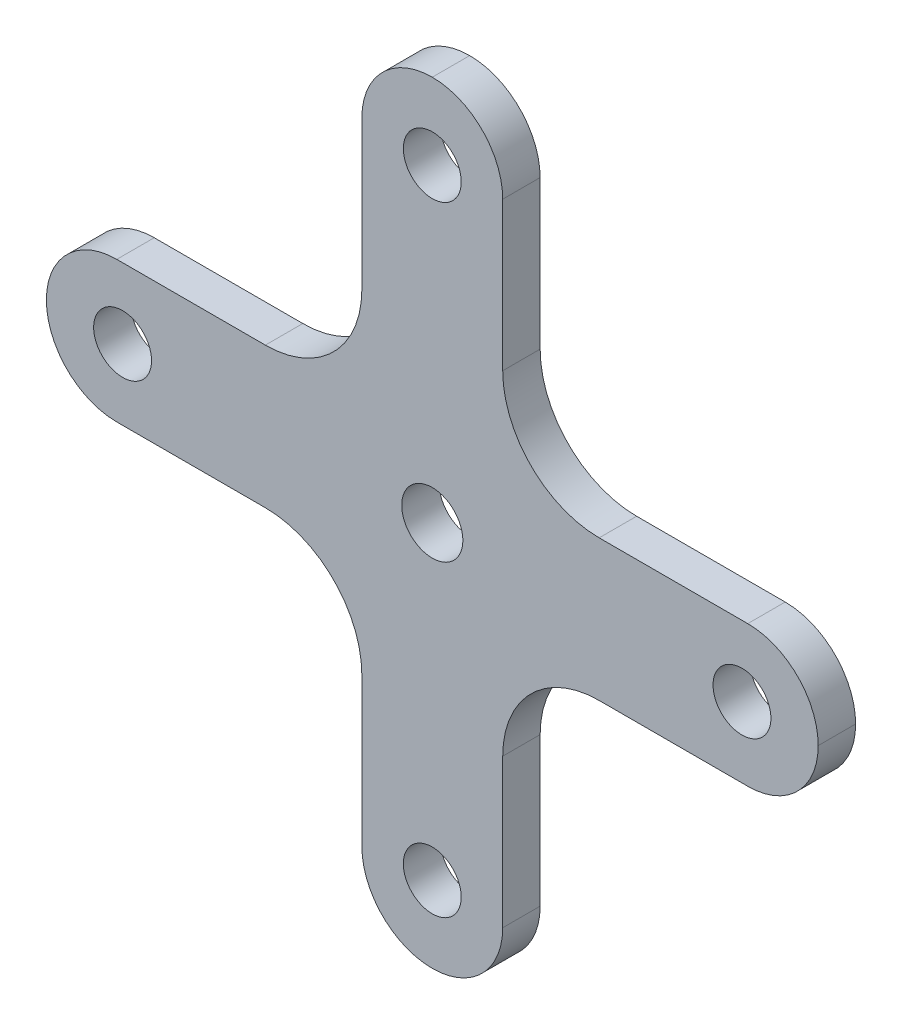
ISO-10303-21;
HEADER;
FILE_DESCRIPTION(('STEP AP214'),'2;1');
FILE_NAME('part.step','',(''),(''),'','','');
FILE_SCHEMA(('AUTOMOTIVE_DESIGN { 1 0 10303 214 1 1 1 1 }'));
ENDSEC;
DATA;
#1=APPLICATION_CONTEXT('core data for automotive mechanical design processes');
#2=APPLICATION_PROTOCOL_DEFINITION('international standard','automotive_design',2000,#1);
#3=PRODUCT_CONTEXT('',#1,'mechanical');
#4=PRODUCT('Part','Part','',(#3));
#5=PRODUCT_RELATED_PRODUCT_CATEGORY('part','',(#4));
#6=PRODUCT_DEFINITION_FORMATION('','',#4);
#7=PRODUCT_DEFINITION_CONTEXT('part definition',#1,'design');
#8=PRODUCT_DEFINITION('design','',#6,#7);
#9=PRODUCT_DEFINITION_SHAPE('','',#8);
#10=(LENGTH_UNIT() NAMED_UNIT(*) SI_UNIT(.MILLI.,.METRE.));
#11=(NAMED_UNIT(*) PLANE_ANGLE_UNIT() SI_UNIT($,.RADIAN.));
#12=(NAMED_UNIT(*) SI_UNIT($,.STERADIAN.) SOLID_ANGLE_UNIT());
#13=UNCERTAINTY_MEASURE_WITH_UNIT(LENGTH_MEASURE(1.E-05),#10,'distance_accuracy_value','');
#14=(GEOMETRIC_REPRESENTATION_CONTEXT(3) GLOBAL_UNCERTAINTY_ASSIGNED_CONTEXT((#13)) GLOBAL_UNIT_ASSIGNED_CONTEXT((#10,
#11,#12)) REPRESENTATION_CONTEXT('',''));
#15=CARTESIAN_POINT('',(0.,0.,0.));
#16=DIRECTION('',(0.,0.,1.));
#17=DIRECTION('',(1.,0.,0.));
#18=AXIS2_PLACEMENT_3D('',#15,#16,#17);
#19=CARTESIAN_POINT('',(-3.64999999999999,0.,0.97));
#20=DIRECTION('',(-1.,0.,0.));
#21=DIRECTION('',(0.,-1.,0.));
#22=AXIS2_PLACEMENT_3D('',#19,#20,#21);
#23=PLANE('',#22);
#24=DIRECTION('',(0.,1.,0.));
#25=VECTOR('',#24,1.);
#26=CARTESIAN_POINT('',(-3.64999999999999,0.,0.97));
#27=LINE('',#26,#25);
#28=CARTESIAN_POINT('',(-3.64999999999999,-16.35,0.97));
#29=VERTEX_POINT('',#28);
#30=CARTESIAN_POINT('',(-3.64999999999999,-8.65,0.97));
#31=VERTEX_POINT('',#30);
#32=EDGE_CURVE('E398',#29,#31,#27,.T.);
#33=ORIENTED_EDGE('',*,*,#32,.T.);
#34=DIRECTION('',(0.,0.,-1.));
#35=VECTOR('',#34,1.);
#36=CARTESIAN_POINT('',(-3.64999999999999,-8.65,0.97));
#37=LINE('',#36,#35);
#38=CARTESIAN_POINT('',(-3.64999999999999,-8.65,-0.97));
#39=VERTEX_POINT('',#38);
#40=EDGE_CURVE('E261',#31,#39,#37,.T.);
#41=ORIENTED_EDGE('',*,*,#40,.T.);
#42=DIRECTION('',(0.,1.,0.));
#43=VECTOR('',#42,1.);
#44=CARTESIAN_POINT('',(-3.64999999999999,0.,-0.97));
#45=LINE('',#44,#43);
#46=CARTESIAN_POINT('',(-3.64999999999999,-16.35,-0.97));
#47=VERTEX_POINT('',#46);
#48=EDGE_CURVE('E434',#47,#39,#45,.T.);
#49=ORIENTED_EDGE('',*,*,#48,.F.);
#50=DIRECTION('',(0.,0.,-1.));
#51=VECTOR('',#50,1.);
#52=CARTESIAN_POINT('',(-3.64999999999999,-16.35,0.97));
#53=LINE('',#52,#51);
#54=EDGE_CURVE('E249',#47,#29,#53,.F.);
#55=ORIENTED_EDGE('',*,*,#54,.T.);
#56=EDGE_LOOP('',(#33,#41,#49,#55));
#57=FACE_BOUND('',#56,.T.);
#58=ADVANCED_FACE('F37',(#57),#23,.T.);
#59=CARTESIAN_POINT('',(3.65000000000001,0.,0.97));
#60=DIRECTION('',(-1.,0.,0.));
#61=DIRECTION('',(0.,-1.,0.));
#62=AXIS2_PLACEMENT_3D('',#59,#60,#61);
#63=PLANE('',#62);
#64=DIRECTION('',(0.,1.,0.));
#65=VECTOR('',#64,1.);
#66=CARTESIAN_POINT('',(3.65000000000001,0.,-0.97));
#67=LINE('',#66,#65);
#68=CARTESIAN_POINT('',(3.65000000000001,-16.35,-0.97));
#69=VERTEX_POINT('',#68);
#70=CARTESIAN_POINT('',(3.65000000000001,-8.65,-0.97));
#71=VERTEX_POINT('',#70);
#72=EDGE_CURVE('E206',#69,#71,#67,.T.);
#73=ORIENTED_EDGE('',*,*,#72,.T.);
#74=DIRECTION('',(0.,0.,-1.));
#75=VECTOR('',#74,1.);
#76=CARTESIAN_POINT('',(3.65000000000001,-8.65,0.97));
#77=LINE('',#76,#75);
#78=CARTESIAN_POINT('',(3.65000000000001,-8.65,0.97));
#79=VERTEX_POINT('',#78);
#80=EDGE_CURVE('E281',#71,#79,#77,.F.);
#81=ORIENTED_EDGE('',*,*,#80,.T.);
#82=DIRECTION('',(0.,1.,0.));
#83=VECTOR('',#82,1.);
#84=CARTESIAN_POINT('',(3.65000000000001,0.,0.97));
#85=LINE('',#84,#83);
#86=CARTESIAN_POINT('',(3.65000000000001,-16.35,0.97));
#87=VERTEX_POINT('',#86);
#88=EDGE_CURVE('E404',#87,#79,#85,.T.);
#89=ORIENTED_EDGE('',*,*,#88,.F.);
#90=DIRECTION('',(0.,0.,-1.));
#91=VECTOR('',#90,1.);
#92=CARTESIAN_POINT('',(3.65000000000001,-16.35,0.97));
#93=LINE('',#92,#91);
#94=EDGE_CURVE('E246',#87,#69,#93,.T.);
#95=ORIENTED_EDGE('',*,*,#94,.T.);
#96=EDGE_LOOP('',(#73,#81,#89,#95));
#97=FACE_BOUND('',#96,.T.);
#98=ADVANCED_FACE('F329',(#97),#63,.F.);
#99=CARTESIAN_POINT('',(0.,-3.65,0.97));
#100=DIRECTION('',(0.,-1.,0.));
#101=DIRECTION('',(1.,0.,0.));
#102=AXIS2_PLACEMENT_3D('',#99,#100,#101);
#103=PLANE('',#102);
#104=DIRECTION('',(-1.,0.,0.));
#105=VECTOR('',#104,1.);
#106=CARTESIAN_POINT('',(0.,-3.65,0.97));
#107=LINE('',#106,#105);
#108=CARTESIAN_POINT('',(16.35,-3.65,0.97));
#109=VERTEX_POINT('',#108);
#110=CARTESIAN_POINT('',(8.65000000000001,-3.65,0.97));
#111=VERTEX_POINT('',#110);
#112=EDGE_CURVE('E408',#109,#111,#107,.T.);
#113=ORIENTED_EDGE('',*,*,#112,.T.);
#114=DIRECTION('',(0.,0.,-1.));
#115=VECTOR('',#114,1.);
#116=CARTESIAN_POINT('',(8.65000000000001,-3.65,0.97));
#117=LINE('',#116,#115);
#118=CARTESIAN_POINT('',(8.65000000000001,-3.65,-0.97));
#119=VERTEX_POINT('',#118);
#120=EDGE_CURVE('E278',#111,#119,#117,.T.);
#121=ORIENTED_EDGE('',*,*,#120,.T.);
#122=DIRECTION('',(-1.,0.,0.));
#123=VECTOR('',#122,1.);
#124=CARTESIAN_POINT('',(0.,-3.65,-0.97));
#125=LINE('',#124,#123);
#126=CARTESIAN_POINT('',(16.35,-3.65,-0.97));
#127=VERTEX_POINT('',#126);
#128=EDGE_CURVE('E201',#127,#119,#125,.T.);
#129=ORIENTED_EDGE('',*,*,#128,.F.);
#130=DIRECTION('',(0.,0.,-1.));
#131=VECTOR('',#130,1.);
#132=CARTESIAN_POINT('',(16.35,-3.65,0.97));
#133=LINE('',#132,#131);
#134=EDGE_CURVE('E244',#127,#109,#133,.F.);
#135=ORIENTED_EDGE('',*,*,#134,.T.);
#136=EDGE_LOOP('',(#113,#121,#129,#135));
#137=FACE_BOUND('',#136,.T.);
#138=ADVANCED_FACE('F335',(#137),#103,.T.);
#139=CARTESIAN_POINT('',(0.,3.65,0.97));
#140=DIRECTION('',(0.,-1.,0.));
#141=DIRECTION('',(1.,0.,0.));
#142=AXIS2_PLACEMENT_3D('',#139,#140,#141);
#143=PLANE('',#142);
#144=DIRECTION('',(-1.,0.,0.));
#145=VECTOR('',#144,1.);
#146=CARTESIAN_POINT('',(0.,3.65,-0.97));
#147=LINE('',#146,#145);
#148=CARTESIAN_POINT('',(16.35,3.65,-0.97));
#149=VERTEX_POINT('',#148);
#150=CARTESIAN_POINT('',(8.65,3.65,-0.97));
#151=VERTEX_POINT('',#150);
#152=EDGE_CURVE('E190',#149,#151,#147,.T.);
#153=ORIENTED_EDGE('',*,*,#152,.T.);
#154=DIRECTION('',(0.,0.,-1.));
#155=VECTOR('',#154,1.);
#156=CARTESIAN_POINT('',(8.65,3.65,0.97));
#157=LINE('',#156,#155);
#158=CARTESIAN_POINT('',(8.65,3.65,0.97));
#159=VERTEX_POINT('',#158);
#160=EDGE_CURVE('E286',#151,#159,#157,.F.);
#161=ORIENTED_EDGE('',*,*,#160,.T.);
#162=DIRECTION('',(-1.,0.,0.));
#163=VECTOR('',#162,1.);
#164=CARTESIAN_POINT('',(0.,3.65,0.97));
#165=LINE('',#164,#163);
#166=CARTESIAN_POINT('',(16.35,3.65,0.97));
#167=VERTEX_POINT('',#166);
#168=EDGE_CURVE('E193',#167,#159,#165,.T.);
#169=ORIENTED_EDGE('',*,*,#168,.F.);
#170=DIRECTION('',(0.,0.,-1.));
#171=VECTOR('',#170,1.);
#172=CARTESIAN_POINT('',(16.35,3.65,0.97));
#173=LINE('',#172,#171);
#174=EDGE_CURVE('E178',#167,#149,#173,.T.);
#175=ORIENTED_EDGE('',*,*,#174,.T.);
#176=EDGE_LOOP('',(#153,#161,#169,#175));
#177=FACE_BOUND('',#176,.T.);
#178=ADVANCED_FACE('F189',(#177),#143,.F.);
#179=CARTESIAN_POINT('',(3.65,0.,0.97));
#180=DIRECTION('',(1.,0.,0.));
#181=DIRECTION('',(0.,1.,0.));
#182=AXIS2_PLACEMENT_3D('',#179,#180,#181);
#183=PLANE('',#182);
#184=DIRECTION('',(0.,-1.,0.));
#185=VECTOR('',#184,1.);
#186=CARTESIAN_POINT('',(3.65,0.,0.97));
#187=LINE('',#186,#185);
#188=CARTESIAN_POINT('',(3.65,16.35,0.97));
#189=VERTEX_POINT('',#188);
#190=CARTESIAN_POINT('',(3.65,8.65,0.97));
#191=VERTEX_POINT('',#190);
#192=EDGE_CURVE('E307',#189,#191,#187,.T.);
#193=ORIENTED_EDGE('',*,*,#192,.T.);
#194=DIRECTION('',(0.,0.,-1.));
#195=VECTOR('',#194,1.);
#196=CARTESIAN_POINT('',(3.65,8.65,0.97));
#197=LINE('',#196,#195);
#198=CARTESIAN_POINT('',(3.65,8.65,-0.97));
#199=VERTEX_POINT('',#198);
#200=EDGE_CURVE('E283',#191,#199,#197,.T.);
#201=ORIENTED_EDGE('',*,*,#200,.T.);
#202=DIRECTION('',(0.,-1.,0.));
#203=VECTOR('',#202,1.);
#204=CARTESIAN_POINT('',(3.65,0.,-0.97));
#205=LINE('',#204,#203);
#206=CARTESIAN_POINT('',(3.65,16.35,-0.97));
#207=VERTEX_POINT('',#206);
#208=EDGE_CURVE('E200',#207,#199,#205,.T.);
#209=ORIENTED_EDGE('',*,*,#208,.F.);
#210=DIRECTION('',(0.,0.,-1.));
#211=VECTOR('',#210,1.);
#212=CARTESIAN_POINT('',(3.65,16.35,0.97));
#213=LINE('',#212,#211);
#214=EDGE_CURVE('E256',#207,#189,#213,.F.);
#215=ORIENTED_EDGE('',*,*,#214,.T.);
#216=EDGE_LOOP('',(#193,#201,#209,#215));
#217=FACE_BOUND('',#216,.T.);
#218=ADVANCED_FACE('F311',(#217),#183,.T.);
#219=CARTESIAN_POINT('',(-3.65,0.,0.97));
#220=DIRECTION('',(1.,0.,0.));
#221=DIRECTION('',(0.,1.,0.));
#222=AXIS2_PLACEMENT_3D('',#219,#220,#221);
#223=PLANE('',#222);
#224=DIRECTION('',(0.,-1.,0.));
#225=VECTOR('',#224,1.);
#226=CARTESIAN_POINT('',(-3.65,0.,-0.97));
#227=LINE('',#226,#225);
#228=CARTESIAN_POINT('',(-3.65,16.35,-0.97));
#229=VERTEX_POINT('',#228);
#230=CARTESIAN_POINT('',(-3.65,8.65,-0.97));
#231=VERTEX_POINT('',#230);
#232=EDGE_CURVE('E203',#229,#231,#227,.T.);
#233=ORIENTED_EDGE('',*,*,#232,.T.);
#234=DIRECTION('',(0.,0.,-1.));
#235=VECTOR('',#234,1.);
#236=CARTESIAN_POINT('',(-3.65,8.65,0.97));
#237=LINE('',#236,#235);
#238=CARTESIAN_POINT('',(-3.65,8.65,0.97));
#239=VERTEX_POINT('',#238);
#240=EDGE_CURVE('E58',#231,#239,#237,.F.);
#241=ORIENTED_EDGE('',*,*,#240,.T.);
#242=DIRECTION('',(0.,-1.,0.));
#243=VECTOR('',#242,1.);
#244=CARTESIAN_POINT('',(-3.65,0.,0.97));
#245=LINE('',#244,#243);
#246=CARTESIAN_POINT('',(-3.65,16.35,0.97));
#247=VERTEX_POINT('',#246);
#248=EDGE_CURVE('E314',#247,#239,#245,.T.);
#249=ORIENTED_EDGE('',*,*,#248,.F.);
#250=DIRECTION('',(0.,0.,-1.));
#251=VECTOR('',#250,1.);
#252=CARTESIAN_POINT('',(-3.65,16.35,-0.97));
#253=LINE('',#252,#251);
#254=EDGE_CURVE('E259',#247,#229,#253,.T.);
#255=ORIENTED_EDGE('',*,*,#254,.T.);
#256=EDGE_LOOP('',(#233,#241,#249,#255));
#257=FACE_BOUND('',#256,.T.);
#258=ADVANCED_FACE('F455',(#257),#223,.F.);
#259=CARTESIAN_POINT('',(0.,3.65,0.97));
#260=DIRECTION('',(0.,1.,0.));
#261=DIRECTION('',(0.,0.,1.));
#262=AXIS2_PLACEMENT_3D('',#259,#260,#261);
#263=PLANE('',#262);
#264=DIRECTION('',(1.,0.,0.));
#265=VECTOR('',#264,1.);
#266=CARTESIAN_POINT('',(0.,3.65,0.97));
#267=LINE('',#266,#265);
#268=CARTESIAN_POINT('',(-16.35,3.65,0.97));
#269=VERTEX_POINT('',#268);
#270=CARTESIAN_POINT('',(-8.65,3.65,0.97));
#271=VERTEX_POINT('',#270);
#272=EDGE_CURVE('E419',#269,#271,#267,.T.);
#273=ORIENTED_EDGE('',*,*,#272,.T.);
#274=DIRECTION('',(0.,0.,-1.));
#275=VECTOR('',#274,1.);
#276=CARTESIAN_POINT('',(-8.65,3.65,0.97));
#277=LINE('',#276,#275);
#278=CARTESIAN_POINT('',(-8.65,3.65,-0.97));
#279=VERTEX_POINT('',#278);
#280=EDGE_CURVE('E288',#271,#279,#277,.T.);
#281=ORIENTED_EDGE('',*,*,#280,.T.);
#282=DIRECTION('',(1.,0.,0.));
#283=VECTOR('',#282,1.);
#284=CARTESIAN_POINT('',(0.,3.65,-0.97));
#285=LINE('',#284,#283);
#286=CARTESIAN_POINT('',(-16.35,3.65,-0.97));
#287=VERTEX_POINT('',#286);
#288=EDGE_CURVE('E211',#287,#279,#285,.T.);
#289=ORIENTED_EDGE('',*,*,#288,.F.);
#290=DIRECTION('',(0.,0.,-1.));
#291=VECTOR('',#290,1.);
#292=CARTESIAN_POINT('',(-16.35,3.65,0.97));
#293=LINE('',#292,#291);
#294=EDGE_CURVE('E254',#287,#269,#293,.F.);
#295=ORIENTED_EDGE('',*,*,#294,.T.);
#296=EDGE_LOOP('',(#273,#281,#289,#295));
#297=FACE_BOUND('',#296,.T.);
#298=ADVANCED_FACE('F345',(#297),#263,.T.);
#299=CARTESIAN_POINT('',(0.,16.05,0.97));
#300=DIRECTION('',(0.,0.,-1.));
#301=DIRECTION('',(-1.,0.,0.));
#302=AXIS2_PLACEMENT_3D('',#299,#300,#301);
#303=CYLINDRICAL_SURFACE('',#302,1.5);
#304=CARTESIAN_POINT('',(0.,16.05,0.97));
#305=DIRECTION('',(0.,0.,1.));
#306=DIRECTION('',(1.,0.,0.));
#307=AXIS2_PLACEMENT_3D('',#304,#305,#306);
#308=CIRCLE('',#307,1.5);
#309=CARTESIAN_POINT('',(1.5,16.05,0.97));
#310=VERTEX_POINT('',#309);
#311=EDGE_CURVE('E405',#310,#310,#308,.T.);
#312=ORIENTED_EDGE('',*,*,#311,.T.);
#313=EDGE_LOOP('',(#312));
#314=FACE_BOUND('',#313,.T.);
#315=CARTESIAN_POINT('',(0.,16.05,-0.97));
#316=DIRECTION('',(0.,0.,1.));
#317=DIRECTION('',(1.,0.,0.));
#318=AXIS2_PLACEMENT_3D('',#315,#316,#317);
#319=CIRCLE('',#318,1.5);
#320=CARTESIAN_POINT('',(1.5,16.05,-0.97));
#321=VERTEX_POINT('',#320);
#322=EDGE_CURVE('E431',#321,#321,#319,.T.);
#323=ORIENTED_EDGE('',*,*,#322,.F.);
#324=EDGE_LOOP('',(#323));
#325=FACE_BOUND('',#324,.T.);
#326=ADVANCED_FACE('F341',(#314,#325),#303,.F.);
#327=CARTESIAN_POINT('',(16.05,0.,0.97));
#328=DIRECTION('',(0.,0.,-1.));
#329=DIRECTION('',(-1.,0.,0.));
#330=AXIS2_PLACEMENT_3D('',#327,#328,#329);
#331=CYLINDRICAL_SURFACE('',#330,1.5);
#332=CARTESIAN_POINT('',(16.05,0.,0.97));
#333=DIRECTION('',(0.,0.,1.));
#334=DIRECTION('',(1.,0.,0.));
#335=AXIS2_PLACEMENT_3D('',#332,#333,#334);
#336=CIRCLE('',#335,1.5);
#337=CARTESIAN_POINT('',(17.55,0.,0.97));
#338=VERTEX_POINT('',#337);
#339=EDGE_CURVE('E411',#338,#338,#336,.T.);
#340=ORIENTED_EDGE('',*,*,#339,.T.);
#341=EDGE_LOOP('',(#340));
#342=FACE_BOUND('',#341,.T.);
#343=CARTESIAN_POINT('',(16.05,0.,-0.97));
#344=DIRECTION('',(0.,0.,1.));
#345=DIRECTION('',(1.,0.,0.));
#346=AXIS2_PLACEMENT_3D('',#343,#344,#345);
#347=CIRCLE('',#346,1.5);
#348=CARTESIAN_POINT('',(17.55,0.,-0.97));
#349=VERTEX_POINT('',#348);
#350=EDGE_CURVE('E428',#349,#349,#347,.T.);
#351=ORIENTED_EDGE('',*,*,#350,.F.);
#352=EDGE_LOOP('',(#351));
#353=FACE_BOUND('',#352,.T.);
#354=ADVANCED_FACE('F344',(#342,#353),#331,.F.);
#355=CARTESIAN_POINT('',(0.,-16.05,0.97));
#356=DIRECTION('',(0.,0.,-1.));
#357=DIRECTION('',(-1.,0.,0.));
#358=AXIS2_PLACEMENT_3D('',#355,#356,#357);
#359=CYLINDRICAL_SURFACE('',#358,1.5);
#360=CARTESIAN_POINT('',(0.,-16.05,0.97));
#361=DIRECTION('',(0.,0.,1.));
#362=DIRECTION('',(1.,0.,0.));
#363=AXIS2_PLACEMENT_3D('',#360,#361,#362);
#364=CIRCLE('',#363,1.5);
#365=CARTESIAN_POINT('',(1.5,-16.05,0.97));
#366=VERTEX_POINT('',#365);
#367=EDGE_CURVE('E485',#366,#366,#364,.T.);
#368=ORIENTED_EDGE('',*,*,#367,.T.);
#369=EDGE_LOOP('',(#368));
#370=FACE_BOUND('',#369,.T.);
#371=CARTESIAN_POINT('',(0.,-16.05,-0.97));
#372=DIRECTION('',(0.,0.,1.));
#373=DIRECTION('',(1.,0.,0.));
#374=AXIS2_PLACEMENT_3D('',#371,#372,#373);
#375=CIRCLE('',#374,1.5);
#376=CARTESIAN_POINT('',(1.5,-16.05,-0.97));
#377=VERTEX_POINT('',#376);
#378=EDGE_CURVE('E425',#377,#377,#375,.T.);
#379=ORIENTED_EDGE('',*,*,#378,.F.);
#380=EDGE_LOOP('',(#379));
#381=FACE_BOUND('',#380,.T.);
#382=ADVANCED_FACE('F349',(#370,#381),#359,.F.);
#383=CARTESIAN_POINT('',(-16.05,0.,0.97));
#384=DIRECTION('',(0.,0.,-1.));
#385=DIRECTION('',(-1.,0.,0.));
#386=AXIS2_PLACEMENT_3D('',#383,#384,#385);
#387=CYLINDRICAL_SURFACE('',#386,1.5);
#388=CARTESIAN_POINT('',(-16.05,0.,0.97));
#389=DIRECTION('',(0.,0.,1.));
#390=DIRECTION('',(1.,0.,0.));
#391=AXIS2_PLACEMENT_3D('',#388,#389,#390);
#392=CIRCLE('',#391,1.5);
#393=CARTESIAN_POINT('',(-14.55,0.,0.97));
#394=VERTEX_POINT('',#393);
#395=EDGE_CURVE('E215',#394,#394,#392,.T.);
#396=ORIENTED_EDGE('',*,*,#395,.T.);
#397=EDGE_LOOP('',(#396));
#398=FACE_BOUND('',#397,.T.);
#399=CARTESIAN_POINT('',(-16.05,0.,-0.97));
#400=DIRECTION('',(0.,0.,1.));
#401=DIRECTION('',(1.,0.,0.));
#402=AXIS2_PLACEMENT_3D('',#399,#400,#401);
#403=CIRCLE('',#402,1.5);
#404=CARTESIAN_POINT('',(-14.55,0.,-0.97));
#405=VERTEX_POINT('',#404);
#406=EDGE_CURVE('E263',#405,#405,#403,.T.);
#407=ORIENTED_EDGE('',*,*,#406,.F.);
#408=EDGE_LOOP('',(#407));
#409=FACE_BOUND('',#408,.T.);
#410=ADVANCED_FACE('F353',(#398,#409),#387,.F.);
#411=CARTESIAN_POINT('',(0.,-3.65,0.97));
#412=DIRECTION('',(0.,1.,0.));
#413=DIRECTION('',(-1.,0.,0.));
#414=AXIS2_PLACEMENT_3D('',#411,#412,#413);
#415=PLANE('',#414);
#416=DIRECTION('',(1.,0.,0.));
#417=VECTOR('',#416,1.);
#418=CARTESIAN_POINT('',(0.,-3.65,-0.97));
#419=LINE('',#418,#417);
#420=CARTESIAN_POINT('',(-16.35,-3.65,-0.97));
#421=VERTEX_POINT('',#420);
#422=CARTESIAN_POINT('',(-8.64999999999999,-3.65,-0.97));
#423=VERTEX_POINT('',#422);
#424=EDGE_CURVE('E213',#421,#423,#419,.T.);
#425=ORIENTED_EDGE('',*,*,#424,.T.);
#426=DIRECTION('',(0.,0.,-1.));
#427=VECTOR('',#426,1.);
#428=CARTESIAN_POINT('',(-8.64999999999999,-3.65,0.97));
#429=LINE('',#428,#427);
#430=CARTESIAN_POINT('',(-8.64999999999999,-3.65,0.97));
#431=VERTEX_POINT('',#430);
#432=EDGE_CURVE('E276',#423,#431,#429,.F.);
#433=ORIENTED_EDGE('',*,*,#432,.T.);
#434=DIRECTION('',(1.,0.,0.));
#435=VECTOR('',#434,1.);
#436=CARTESIAN_POINT('',(0.,-3.65,0.97));
#437=LINE('',#436,#435);
#438=CARTESIAN_POINT('',(-16.35,-3.65,0.97));
#439=VERTEX_POINT('',#438);
#440=EDGE_CURVE('E195',#439,#431,#437,.T.);
#441=ORIENTED_EDGE('',*,*,#440,.F.);
#442=DIRECTION('',(0.,0.,-1.));
#443=VECTOR('',#442,1.);
#444=CARTESIAN_POINT('',(-16.35,-3.65,-0.97));
#445=LINE('',#444,#443);
#446=EDGE_CURVE('E251',#439,#421,#445,.T.);
#447=ORIENTED_EDGE('',*,*,#446,.T.);
#448=EDGE_LOOP('',(#425,#433,#441,#447));
#449=FACE_BOUND('',#448,.T.);
#450=ADVANCED_FACE('F357',(#449),#415,.F.);
#451=CARTESIAN_POINT('',(0.,0.,0.97));
#452=DIRECTION('',(0.,0.,1.));
#453=DIRECTION('',(1.,0.,0.));
#454=AXIS2_PLACEMENT_3D('',#451,#452,#453);
#455=PLANE('',#454);
#456=CARTESIAN_POINT('',(0.,0.,0.97));
#457=DIRECTION('',(0.,0.,1.));
#458=DIRECTION('',(1.,0.,0.));
#459=AXIS2_PLACEMENT_3D('',#456,#457,#458);
#460=CIRCLE('',#459,1.585);
#461=CARTESIAN_POINT('',(1.585,0.,0.97));
#462=VERTEX_POINT('',#461);
#463=EDGE_CURVE('E479',#462,#462,#460,.T.);
#464=ORIENTED_EDGE('',*,*,#463,.F.);
#465=EDGE_LOOP('',(#464));
#466=FACE_BOUND('',#465,.T.);
#467=ORIENTED_EDGE('',*,*,#395,.F.);
#468=EDGE_LOOP('',(#467));
#469=FACE_BOUND('',#468,.T.);
#470=ORIENTED_EDGE('',*,*,#367,.F.);
#471=EDGE_LOOP('',(#470));
#472=FACE_BOUND('',#471,.T.);
#473=ORIENTED_EDGE('',*,*,#339,.F.);
#474=EDGE_LOOP('',(#473));
#475=FACE_BOUND('',#474,.T.);
#476=ORIENTED_EDGE('',*,*,#311,.F.);
#477=EDGE_LOOP('',(#476));
#478=FACE_BOUND('',#477,.T.);
#479=CARTESIAN_POINT('',(16.35,0.,0.97));
#480=DIRECTION('',(0.,0.,1.));
#481=DIRECTION('',(1.,0.,0.));
#482=AXIS2_PLACEMENT_3D('',#479,#480,#481);
#483=CIRCLE('',#482,3.65);
#484=CARTESIAN_POINT('',(20.,0.,0.97));
#485=VERTEX_POINT('',#484);
#486=EDGE_CURVE('E240',#109,#485,#483,.T.);
#487=ORIENTED_EDGE('',*,*,#486,.T.);
#488=CARTESIAN_POINT('',(16.35,0.,0.97));
#489=DIRECTION('',(0.,0.,1.));
#490=DIRECTION('',(1.,0.,0.));
#491=AXIS2_PLACEMENT_3D('',#488,#489,#490);
#492=CIRCLE('',#491,3.65);
#493=EDGE_CURVE('E242',#485,#167,#492,.T.);
#494=ORIENTED_EDGE('',*,*,#493,.T.);
#495=ORIENTED_EDGE('',*,*,#168,.T.);
#496=CARTESIAN_POINT('',(8.65,8.65,0.97));
#497=DIRECTION('',(0.,0.,1.));
#498=DIRECTION('',(1.,0.,0.));
#499=AXIS2_PLACEMENT_3D('',#496,#497,#498);
#500=CIRCLE('',#499,5.);
#501=EDGE_CURVE('E301',#159,#191,#500,.F.);
#502=ORIENTED_EDGE('',*,*,#501,.T.);
#503=ORIENTED_EDGE('',*,*,#192,.F.);
#504=CARTESIAN_POINT('',(0.,16.35,0.97));
#505=DIRECTION('',(0.,0.,1.));
#506=DIRECTION('',(1.,0.,0.));
#507=AXIS2_PLACEMENT_3D('',#504,#505,#506);
#508=CIRCLE('',#507,3.65);
#509=CARTESIAN_POINT('',(0.,20.,0.97));
#510=VERTEX_POINT('',#509);
#511=EDGE_CURVE('E230',#189,#510,#508,.T.);
#512=ORIENTED_EDGE('',*,*,#511,.T.);
#513=CARTESIAN_POINT('',(0.,16.35,0.97));
#514=DIRECTION('',(0.,0.,1.));
#515=DIRECTION('',(1.,0.,0.));
#516=AXIS2_PLACEMENT_3D('',#513,#514,#515);
#517=CIRCLE('',#516,3.65);
#518=EDGE_CURVE('E183',#510,#247,#517,.T.);
#519=ORIENTED_EDGE('',*,*,#518,.T.);
#520=ORIENTED_EDGE('',*,*,#248,.T.);
#521=CARTESIAN_POINT('',(-8.65,8.65,0.97));
#522=DIRECTION('',(0.,0.,1.));
#523=DIRECTION('',(1.,0.,0.));
#524=AXIS2_PLACEMENT_3D('',#521,#522,#523);
#525=CIRCLE('',#524,5.);
#526=EDGE_CURVE('E11',#239,#271,#525,.F.);
#527=ORIENTED_EDGE('',*,*,#526,.T.);
#528=ORIENTED_EDGE('',*,*,#272,.F.);
#529=CARTESIAN_POINT('',(-16.35,0.,0.97));
#530=DIRECTION('',(0.,0.,1.));
#531=DIRECTION('',(1.,0.,0.));
#532=AXIS2_PLACEMENT_3D('',#529,#530,#531);
#533=CIRCLE('',#532,3.65);
#534=CARTESIAN_POINT('',(-20.,0.,0.97));
#535=VERTEX_POINT('',#534);
#536=EDGE_CURVE('E232',#269,#535,#533,.T.);
#537=ORIENTED_EDGE('',*,*,#536,.T.);
#538=CARTESIAN_POINT('',(-16.35,0.,0.97));
#539=DIRECTION('',(0.,0.,1.));
#540=DIRECTION('',(1.,0.,0.));
#541=AXIS2_PLACEMENT_3D('',#538,#539,#540);
#542=CIRCLE('',#541,3.65);
#543=EDGE_CURVE('E234',#535,#439,#542,.T.);
#544=ORIENTED_EDGE('',*,*,#543,.T.);
#545=ORIENTED_EDGE('',*,*,#440,.T.);
#546=CARTESIAN_POINT('',(-8.64999999999999,-8.65,0.97));
#547=DIRECTION('',(0.,0.,1.));
#548=DIRECTION('',(1.,0.,0.));
#549=AXIS2_PLACEMENT_3D('',#546,#547,#548);
#550=CIRCLE('',#549,5.);
#551=EDGE_CURVE('E294',#431,#31,#550,.F.);
#552=ORIENTED_EDGE('',*,*,#551,.T.);
#553=ORIENTED_EDGE('',*,*,#32,.F.);
#554=CARTESIAN_POINT('',(0.,-16.35,0.97));
#555=DIRECTION('',(0.,0.,1.));
#556=DIRECTION('',(1.,0.,0.));
#557=AXIS2_PLACEMENT_3D('',#554,#555,#556);
#558=CIRCLE('',#557,3.65);
#559=CARTESIAN_POINT('',(0.,-20.,0.97));
#560=VERTEX_POINT('',#559);
#561=EDGE_CURVE('E236',#29,#560,#558,.T.);
#562=ORIENTED_EDGE('',*,*,#561,.T.);
#563=CARTESIAN_POINT('',(0.,-16.35,0.97));
#564=DIRECTION('',(0.,0.,1.));
#565=DIRECTION('',(1.,0.,0.));
#566=AXIS2_PLACEMENT_3D('',#563,#564,#565);
#567=CIRCLE('',#566,3.65);
#568=EDGE_CURVE('E238',#560,#87,#567,.T.);
#569=ORIENTED_EDGE('',*,*,#568,.T.);
#570=ORIENTED_EDGE('',*,*,#88,.T.);
#571=CARTESIAN_POINT('',(8.65000000000001,-8.65,0.97));
#572=DIRECTION('',(0.,0.,1.));
#573=DIRECTION('',(1.,0.,0.));
#574=AXIS2_PLACEMENT_3D('',#571,#572,#573);
#575=CIRCLE('',#574,5.);
#576=EDGE_CURVE('E298',#79,#111,#575,.F.);
#577=ORIENTED_EDGE('',*,*,#576,.T.);
#578=ORIENTED_EDGE('',*,*,#112,.F.);
#579=EDGE_LOOP('',(#487,#494,#495,#502,#503,#512,#519,#520,#527,#528,#537,#544,#545,#552,#553,
#562,#569,#570,#577,#578));
#580=FACE_BOUND('',#579,.T.);
#581=ADVANCED_FACE('F306',(#466,#469,#472,#475,#478,#580),#455,.T.);
#582=CARTESIAN_POINT('',(0.,0.,-0.97));
#583=DIRECTION('',(0.,0.,1.));
#584=DIRECTION('',(1.,0.,0.));
#585=AXIS2_PLACEMENT_3D('',#582,#583,#584);
#586=PLANE('',#585);
#587=CARTESIAN_POINT('',(0.,0.,-0.97));
#588=DIRECTION('',(0.,0.,1.));
#589=DIRECTION('',(1.,0.,0.));
#590=AXIS2_PLACEMENT_3D('',#587,#588,#589);
#591=CIRCLE('',#590,1.585);
#592=CARTESIAN_POINT('',(1.585,0.,-0.97));
#593=VERTEX_POINT('',#592);
#594=EDGE_CURVE('E273',#593,#593,#591,.T.);
#595=ORIENTED_EDGE('',*,*,#594,.T.);
#596=EDGE_LOOP('',(#595));
#597=FACE_BOUND('',#596,.T.);
#598=ORIENTED_EDGE('',*,*,#406,.T.);
#599=EDGE_LOOP('',(#598));
#600=FACE_BOUND('',#599,.T.);
#601=ORIENTED_EDGE('',*,*,#378,.T.);
#602=EDGE_LOOP('',(#601));
#603=FACE_BOUND('',#602,.T.);
#604=ORIENTED_EDGE('',*,*,#350,.T.);
#605=EDGE_LOOP('',(#604));
#606=FACE_BOUND('',#605,.T.);
#607=ORIENTED_EDGE('',*,*,#322,.T.);
#608=EDGE_LOOP('',(#607));
#609=FACE_BOUND('',#608,.T.);
#610=ORIENTED_EDGE('',*,*,#152,.F.);
#611=CARTESIAN_POINT('',(16.35,0.,-0.97));
#612=DIRECTION('',(0.,0.,1.));
#613=DIRECTION('',(1.,0.,0.));
#614=AXIS2_PLACEMENT_3D('',#611,#612,#613);
#615=CIRCLE('',#614,3.65);
#616=CARTESIAN_POINT('',(20.,0.,-0.97));
#617=VERTEX_POINT('',#616);
#618=EDGE_CURVE('E174',#149,#617,#615,.F.);
#619=ORIENTED_EDGE('',*,*,#618,.T.);
#620=CARTESIAN_POINT('',(16.35,0.,-0.97));
#621=DIRECTION('',(0.,0.,1.));
#622=DIRECTION('',(1.,0.,0.));
#623=AXIS2_PLACEMENT_3D('',#620,#621,#622);
#624=CIRCLE('',#623,3.65);
#625=EDGE_CURVE('E184',#617,#127,#624,.F.);
#626=ORIENTED_EDGE('',*,*,#625,.T.);
#627=ORIENTED_EDGE('',*,*,#128,.T.);
#628=CARTESIAN_POINT('',(8.65000000000001,-8.65,-0.97));
#629=DIRECTION('',(0.,0.,1.));
#630=DIRECTION('',(1.,0.,0.));
#631=AXIS2_PLACEMENT_3D('',#628,#629,#630);
#632=CIRCLE('',#631,5.);
#633=EDGE_CURVE('E296',#119,#71,#632,.T.);
#634=ORIENTED_EDGE('',*,*,#633,.T.);
#635=ORIENTED_EDGE('',*,*,#72,.F.);
#636=CARTESIAN_POINT('',(0.,-16.35,-0.97));
#637=DIRECTION('',(0.,0.,1.));
#638=DIRECTION('',(1.,0.,0.));
#639=AXIS2_PLACEMENT_3D('',#636,#637,#638);
#640=CIRCLE('',#639,3.65);
#641=CARTESIAN_POINT('',(0.,-20.,-0.97));
#642=VERTEX_POINT('',#641);
#643=EDGE_CURVE('E226',#69,#642,#640,.F.);
#644=ORIENTED_EDGE('',*,*,#643,.T.);
#645=CARTESIAN_POINT('',(0.,-16.35,-0.97));
#646=DIRECTION('',(0.,0.,1.));
#647=DIRECTION('',(1.,0.,0.));
#648=AXIS2_PLACEMENT_3D('',#645,#646,#647);
#649=CIRCLE('',#648,3.65);
#650=EDGE_CURVE('E224',#642,#47,#649,.F.);
#651=ORIENTED_EDGE('',*,*,#650,.T.);
#652=ORIENTED_EDGE('',*,*,#48,.T.);
#653=CARTESIAN_POINT('',(-8.64999999999999,-8.65,-0.97));
#654=DIRECTION('',(0.,0.,1.));
#655=DIRECTION('',(1.,0.,0.));
#656=AXIS2_PLACEMENT_3D('',#653,#654,#655);
#657=CIRCLE('',#656,5.);
#658=EDGE_CURVE('E292',#39,#423,#657,.T.);
#659=ORIENTED_EDGE('',*,*,#658,.T.);
#660=ORIENTED_EDGE('',*,*,#424,.F.);
#661=CARTESIAN_POINT('',(-16.35,0.,-0.97));
#662=DIRECTION('',(0.,0.,1.));
#663=DIRECTION('',(1.,0.,0.));
#664=AXIS2_PLACEMENT_3D('',#661,#662,#663);
#665=CIRCLE('',#664,3.65);
#666=CARTESIAN_POINT('',(-20.,0.,-0.97));
#667=VERTEX_POINT('',#666);
#668=EDGE_CURVE('E222',#421,#667,#665,.F.);
#669=ORIENTED_EDGE('',*,*,#668,.T.);
#670=CARTESIAN_POINT('',(-16.35,0.,-0.97));
#671=DIRECTION('',(0.,0.,1.));
#672=DIRECTION('',(1.,0.,0.));
#673=AXIS2_PLACEMENT_3D('',#670,#671,#672);
#674=CIRCLE('',#673,3.65);
#675=EDGE_CURVE('E220',#667,#287,#674,.F.);
#676=ORIENTED_EDGE('',*,*,#675,.T.);
#677=ORIENTED_EDGE('',*,*,#288,.T.);
#678=CARTESIAN_POINT('',(-8.65,8.65,-0.97));
#679=DIRECTION('',(0.,0.,1.));
#680=DIRECTION('',(1.,0.,0.));
#681=AXIS2_PLACEMENT_3D('',#678,#679,#680);
#682=CIRCLE('',#681,5.);
#683=EDGE_CURVE('E45',#279,#231,#682,.T.);
#684=ORIENTED_EDGE('',*,*,#683,.T.);
#685=ORIENTED_EDGE('',*,*,#232,.F.);
#686=CARTESIAN_POINT('',(0.,16.35,-0.97));
#687=DIRECTION('',(0.,0.,1.));
#688=DIRECTION('',(1.,0.,0.));
#689=AXIS2_PLACEMENT_3D('',#686,#687,#688);
#690=CIRCLE('',#689,3.65);
#691=CARTESIAN_POINT('',(0.,20.,-0.97));
#692=VERTEX_POINT('',#691);
#693=EDGE_CURVE('E194',#229,#692,#690,.F.);
#694=ORIENTED_EDGE('',*,*,#693,.T.);
#695=CARTESIAN_POINT('',(0.,16.35,-0.97));
#696=DIRECTION('',(0.,0.,1.));
#697=DIRECTION('',(1.,0.,0.));
#698=AXIS2_PLACEMENT_3D('',#695,#696,#697);
#699=CIRCLE('',#698,3.65);
#700=EDGE_CURVE('E218',#692,#207,#699,.F.);
#701=ORIENTED_EDGE('',*,*,#700,.T.);
#702=ORIENTED_EDGE('',*,*,#208,.T.);
#703=CARTESIAN_POINT('',(8.65,8.65,-0.97));
#704=DIRECTION('',(0.,0.,1.));
#705=DIRECTION('',(1.,0.,0.));
#706=AXIS2_PLACEMENT_3D('',#703,#704,#705);
#707=CIRCLE('',#706,5.);
#708=EDGE_CURVE('E199',#199,#151,#707,.T.);
#709=ORIENTED_EDGE('',*,*,#708,.T.);
#710=EDGE_LOOP('',(#610,#619,#626,#627,#634,#635,#644,#651,#652,#659,#660,#669,#676,#677,#684,
#685,#694,#701,#702,#709));
#711=FACE_BOUND('',#710,.T.);
#712=ADVANCED_FACE('F197',(#597,#600,#603,#606,#609,#711),#586,.F.);
#713=CARTESIAN_POINT('',(16.35,0.,0.97));
#714=DIRECTION('',(0.,0.,1.));
#715=DIRECTION('',(1.,0.,0.));
#716=AXIS2_PLACEMENT_3D('',#713,#714,#715);
#717=CYLINDRICAL_SURFACE('',#716,3.65);
#718=DIRECTION('',(0.,0.,-1.));
#719=VECTOR('',#718,1.);
#720=CARTESIAN_POINT('',(20.,0.,-0.97));
#721=LINE('',#720,#719);
#722=EDGE_CURVE('E180',#485,#617,#721,.T.);
#723=ORIENTED_EDGE('',*,*,#722,.F.);
#724=ORIENTED_EDGE('',*,*,#486,.F.);
#725=ORIENTED_EDGE('',*,*,#134,.F.);
#726=ORIENTED_EDGE('',*,*,#625,.F.);
#727=EDGE_LOOP('',(#723,#724,#725,#726));
#728=FACE_BOUND('',#727,.T.);
#729=ADVANCED_FACE('F362',(#728),#717,.T.);
#730=CARTESIAN_POINT('',(16.35,0.,0.97));
#731=DIRECTION('',(0.,0.,-1.));
#732=DIRECTION('',(-1.,0.,0.));
#733=AXIS2_PLACEMENT_3D('',#730,#731,#732);
#734=CYLINDRICAL_SURFACE('',#733,3.65);
#735=ORIENTED_EDGE('',*,*,#493,.F.);
#736=ORIENTED_EDGE('',*,*,#722,.T.);
#737=ORIENTED_EDGE('',*,*,#618,.F.);
#738=ORIENTED_EDGE('',*,*,#174,.F.);
#739=EDGE_LOOP('',(#735,#736,#737,#738));
#740=FACE_BOUND('',#739,.T.);
#741=ADVANCED_FACE('F177',(#740),#734,.T.);
#742=CARTESIAN_POINT('',(0.,-16.35,0.97));
#743=DIRECTION('',(0.,0.,1.));
#744=DIRECTION('',(1.,0.,0.));
#745=AXIS2_PLACEMENT_3D('',#742,#743,#744);
#746=CYLINDRICAL_SURFACE('',#745,3.65);
#747=DIRECTION('',(0.,0.,-1.));
#748=VECTOR('',#747,1.);
#749=CARTESIAN_POINT('',(0.,-20.,-0.97));
#750=LINE('',#749,#748);
#751=EDGE_CURVE('E264',#560,#642,#750,.T.);
#752=ORIENTED_EDGE('',*,*,#751,.F.);
#753=ORIENTED_EDGE('',*,*,#561,.F.);
#754=ORIENTED_EDGE('',*,*,#54,.F.);
#755=ORIENTED_EDGE('',*,*,#650,.F.);
#756=EDGE_LOOP('',(#752,#753,#754,#755));
#757=FACE_BOUND('',#756,.T.);
#758=ADVANCED_FACE('F361',(#757),#746,.T.);
#759=CARTESIAN_POINT('',(0.,-16.35,0.97));
#760=DIRECTION('',(0.,0.,-1.));
#761=DIRECTION('',(-1.,0.,0.));
#762=AXIS2_PLACEMENT_3D('',#759,#760,#761);
#763=CYLINDRICAL_SURFACE('',#762,3.65);
#764=ORIENTED_EDGE('',*,*,#568,.F.);
#765=ORIENTED_EDGE('',*,*,#751,.T.);
#766=ORIENTED_EDGE('',*,*,#643,.F.);
#767=ORIENTED_EDGE('',*,*,#94,.F.);
#768=EDGE_LOOP('',(#764,#765,#766,#767));
#769=FACE_BOUND('',#768,.T.);
#770=ADVANCED_FACE('F366',(#769),#763,.T.);
#771=CARTESIAN_POINT('',(-16.35,0.,0.97));
#772=DIRECTION('',(0.,0.,-1.));
#773=DIRECTION('',(-1.,0.,0.));
#774=AXIS2_PLACEMENT_3D('',#771,#772,#773);
#775=CYLINDRICAL_SURFACE('',#774,3.65);
#776=DIRECTION('',(0.,0.,-1.));
#777=VECTOR('',#776,1.);
#778=CARTESIAN_POINT('',(-20.,0.,0.97));
#779=LINE('',#778,#777);
#780=EDGE_CURVE('E267',#535,#667,#779,.T.);
#781=ORIENTED_EDGE('',*,*,#780,.F.);
#782=ORIENTED_EDGE('',*,*,#536,.F.);
#783=ORIENTED_EDGE('',*,*,#294,.F.);
#784=ORIENTED_EDGE('',*,*,#675,.F.);
#785=EDGE_LOOP('',(#781,#782,#783,#784));
#786=FACE_BOUND('',#785,.T.);
#787=ADVANCED_FACE('F369',(#786),#775,.T.);
#788=CARTESIAN_POINT('',(-16.35,0.,0.97));
#789=DIRECTION('',(0.,0.,1.));
#790=DIRECTION('',(1.,0.,0.));
#791=AXIS2_PLACEMENT_3D('',#788,#789,#790);
#792=CYLINDRICAL_SURFACE('',#791,3.65);
#793=ORIENTED_EDGE('',*,*,#543,.F.);
#794=ORIENTED_EDGE('',*,*,#780,.T.);
#795=ORIENTED_EDGE('',*,*,#668,.F.);
#796=ORIENTED_EDGE('',*,*,#446,.F.);
#797=EDGE_LOOP('',(#793,#794,#795,#796));
#798=FACE_BOUND('',#797,.T.);
#799=ADVANCED_FACE('F374',(#798),#792,.T.);
#800=CARTESIAN_POINT('',(0.,16.35,0.97));
#801=DIRECTION('',(0.,0.,1.));
#802=DIRECTION('',(1.,0.,0.));
#803=AXIS2_PLACEMENT_3D('',#800,#801,#802);
#804=CYLINDRICAL_SURFACE('',#803,3.65);
#805=ORIENTED_EDGE('',*,*,#254,.F.);
#806=ORIENTED_EDGE('',*,*,#518,.F.);
#807=DIRECTION('',(0.,0.,-1.));
#808=VECTOR('',#807,1.);
#809=CARTESIAN_POINT('',(0.,20.,0.97));
#810=LINE('',#809,#808);
#811=EDGE_CURVE('E270',#692,#510,#810,.F.);
#812=ORIENTED_EDGE('',*,*,#811,.F.);
#813=ORIENTED_EDGE('',*,*,#693,.F.);
#814=EDGE_LOOP('',(#805,#806,#812,#813));
#815=FACE_BOUND('',#814,.T.);
#816=ADVANCED_FACE('F377',(#815),#804,.T.);
#817=CARTESIAN_POINT('',(0.,16.35,0.97));
#818=DIRECTION('',(0.,0.,-1.));
#819=DIRECTION('',(-1.,0.,0.));
#820=AXIS2_PLACEMENT_3D('',#817,#818,#819);
#821=CYLINDRICAL_SURFACE('',#820,3.65);
#822=ORIENTED_EDGE('',*,*,#511,.F.);
#823=ORIENTED_EDGE('',*,*,#214,.F.);
#824=ORIENTED_EDGE('',*,*,#700,.F.);
#825=ORIENTED_EDGE('',*,*,#811,.T.);
#826=EDGE_LOOP('',(#822,#823,#824,#825));
#827=FACE_BOUND('',#826,.T.);
#828=ADVANCED_FACE('F382',(#827),#821,.T.);
#829=CARTESIAN_POINT('',(-8.64999999999999,-8.65,0.97));
#830=DIRECTION('',(0.,0.,-1.));
#831=DIRECTION('',(-1.,0.,0.));
#832=AXIS2_PLACEMENT_3D('',#829,#830,#831);
#833=CYLINDRICAL_SURFACE('',#832,5.);
#834=ORIENTED_EDGE('',*,*,#551,.F.);
#835=ORIENTED_EDGE('',*,*,#432,.F.);
#836=ORIENTED_EDGE('',*,*,#658,.F.);
#837=ORIENTED_EDGE('',*,*,#40,.F.);
#838=EDGE_LOOP('',(#834,#835,#836,#837));
#839=FACE_BOUND('',#838,.T.);
#840=ADVANCED_FACE('F325',(#839),#833,.F.);
#841=CARTESIAN_POINT('',(8.65000000000001,-8.65,0.97));
#842=DIRECTION('',(0.,0.,-1.));
#843=DIRECTION('',(-1.,0.,0.));
#844=AXIS2_PLACEMENT_3D('',#841,#842,#843);
#845=CYLINDRICAL_SURFACE('',#844,5.);
#846=ORIENTED_EDGE('',*,*,#576,.F.);
#847=ORIENTED_EDGE('',*,*,#80,.F.);
#848=ORIENTED_EDGE('',*,*,#633,.F.);
#849=ORIENTED_EDGE('',*,*,#120,.F.);
#850=EDGE_LOOP('',(#846,#847,#848,#849));
#851=FACE_BOUND('',#850,.T.);
#852=ADVANCED_FACE('F318',(#851),#845,.F.);
#853=CARTESIAN_POINT('',(8.65,8.65,0.97));
#854=DIRECTION('',(0.,0.,-1.));
#855=DIRECTION('',(-1.,0.,0.));
#856=AXIS2_PLACEMENT_3D('',#853,#854,#855);
#857=CYLINDRICAL_SURFACE('',#856,5.);
#858=ORIENTED_EDGE('',*,*,#501,.F.);
#859=ORIENTED_EDGE('',*,*,#160,.F.);
#860=ORIENTED_EDGE('',*,*,#708,.F.);
#861=ORIENTED_EDGE('',*,*,#200,.F.);
#862=EDGE_LOOP('',(#858,#859,#860,#861));
#863=FACE_BOUND('',#862,.T.);
#864=ADVANCED_FACE('F316',(#863),#857,.F.);
#865=CARTESIAN_POINT('',(-8.65,8.65,0.97));
#866=DIRECTION('',(0.,0.,-1.));
#867=DIRECTION('',(-1.,0.,0.));
#868=AXIS2_PLACEMENT_3D('',#865,#866,#867);
#869=CYLINDRICAL_SURFACE('',#868,5.);
#870=ORIENTED_EDGE('',*,*,#526,.F.);
#871=ORIENTED_EDGE('',*,*,#240,.F.);
#872=ORIENTED_EDGE('',*,*,#683,.F.);
#873=ORIENTED_EDGE('',*,*,#280,.F.);
#874=EDGE_LOOP('',(#870,#871,#872,#873));
#875=FACE_BOUND('',#874,.T.);
#876=ADVANCED_FACE('F39',(#875),#869,.F.);
#877=CARTESIAN_POINT('',(0.,0.,-0.97));
#878=DIRECTION('',(0.,0.,1.));
#879=DIRECTION('',(1.,0.,0.));
#880=AXIS2_PLACEMENT_3D('',#877,#878,#879);
#881=CYLINDRICAL_SURFACE('',#880,1.585);
#882=ORIENTED_EDGE('',*,*,#594,.F.);
#883=EDGE_LOOP('',(#882));
#884=FACE_BOUND('',#883,.T.);
#885=ORIENTED_EDGE('',*,*,#463,.T.);
#886=EDGE_LOOP('',(#885));
#887=FACE_BOUND('',#886,.T.);
#888=ADVANCED_FACE('F323',(#884,#887),#881,.F.);
#889=CLOSED_SHELL('',(#58,#98,#138,#178,#218,#258,#298,#326,#354,#382,#410,#450,#581,#712,#729,
#741,#758,#770,#787,#799,#816,#828,#840,#852,#864,#876,#888));
#890=MANIFOLD_SOLID_BREP('B2',#889);
#891=ADVANCED_BREP_SHAPE_REPRESENTATION('',(#18,#890),#14);
#892=SHAPE_DEFINITION_REPRESENTATION(#9,#891);
ENDSEC;
END-ISO-10303-21;
